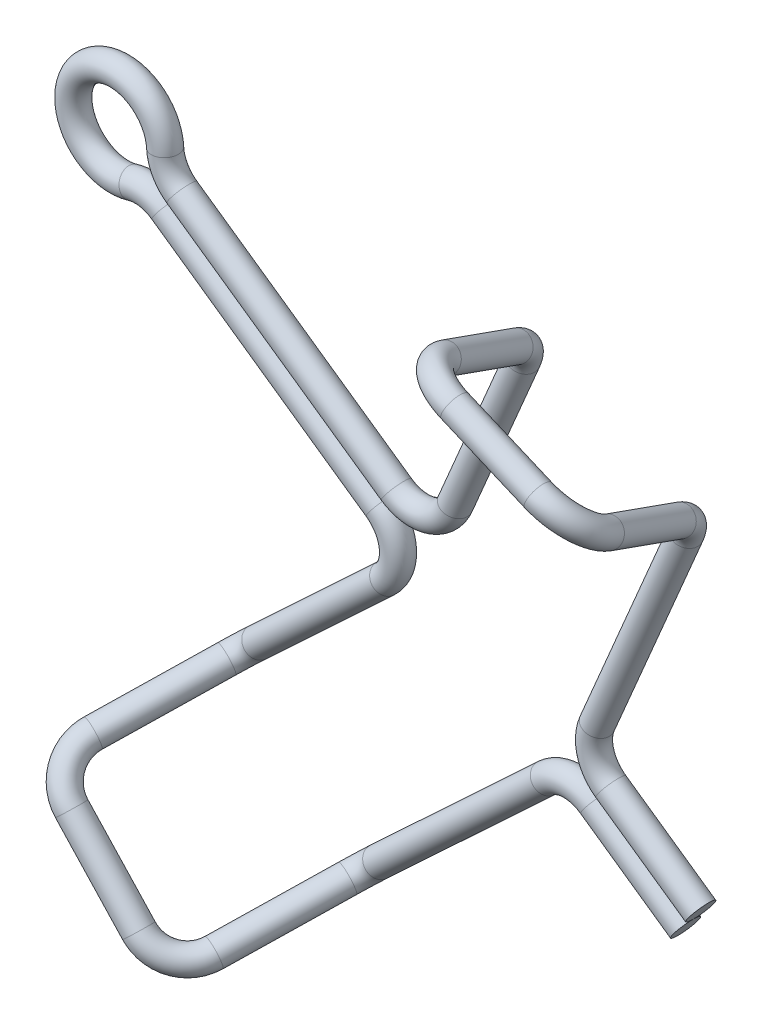
ISO-10303-21;
HEADER;
FILE_DESCRIPTION(('STEP AP214'),'2;1');
FILE_NAME('part.step','',(''),(''),'','','');
FILE_SCHEMA(('AUTOMOTIVE_DESIGN { 1 0 10303 214 1 1 1 1 }'));
ENDSEC;
DATA;
#1=APPLICATION_CONTEXT('core data for automotive mechanical design processes');
#2=APPLICATION_PROTOCOL_DEFINITION('international standard','automotive_design',2000,#1);
#3=PRODUCT_CONTEXT('',#1,'mechanical');
#4=PRODUCT('Part','Part','',(#3));
#5=PRODUCT_RELATED_PRODUCT_CATEGORY('part','',(#4));
#6=PRODUCT_DEFINITION_FORMATION('','',#4);
#7=PRODUCT_DEFINITION_CONTEXT('part definition',#1,'design');
#8=PRODUCT_DEFINITION('design','',#6,#7);
#9=PRODUCT_DEFINITION_SHAPE('','',#8);
#10=(LENGTH_UNIT() NAMED_UNIT(*) SI_UNIT(.MILLI.,.METRE.));
#11=(NAMED_UNIT(*) PLANE_ANGLE_UNIT() SI_UNIT($,.RADIAN.));
#12=(NAMED_UNIT(*) SI_UNIT($,.STERADIAN.) SOLID_ANGLE_UNIT());
#13=UNCERTAINTY_MEASURE_WITH_UNIT(LENGTH_MEASURE(1.E-05),#10,'distance_accuracy_value','');
#14=(GEOMETRIC_REPRESENTATION_CONTEXT(3) GLOBAL_UNCERTAINTY_ASSIGNED_CONTEXT((#13)) GLOBAL_UNIT_ASSIGNED_CONTEXT((#10,
#11,#12)) REPRESENTATION_CONTEXT('',''));
#15=CARTESIAN_POINT('',(0.,0.,0.));
#16=DIRECTION('',(0.,0.,1.));
#17=DIRECTION('',(1.,0.,0.));
#18=AXIS2_PLACEMENT_3D('',#15,#16,#17);
#19=CARTESIAN_POINT('',(31.8925850738149,21.4058785131704,-5.74237859128242));
#20=DIRECTION('',(-0.819202095156444,0.573504949665905,0.));
#21=DIRECTION('',(-0.573504949665905,-0.819202095156444,0.));
#22=AXIS2_PLACEMENT_3D('',#19,#20,#21);
#23=PLANE('',#22);
#24=CARTESIAN_POINT('',(31.8925850738149,21.4058785131704,-5.74237859128242));
#25=DIRECTION('',(0.819202095156458,-0.573504949665886,0.));
#26=DIRECTION('',(0.573504949665886,0.819202095156458,0.));
#27=AXIS2_PLACEMENT_3D('',#24,#25,#26);
#28=CIRCLE('',#27,0.254);
#29=CARTESIAN_POINT('',(32.0382553310301,21.6139558453402,-5.74237859128242));
#30=VERTEX_POINT('',#29);
#31=EDGE_CURVE('E18',#30,#30,#28,.F.);
#32=ORIENTED_EDGE('',*,*,#31,.F.);
#33=EDGE_LOOP('',(#32));
#34=FACE_BOUND('',#33,.T.);
#35=ADVANCED_FACE('F15',(#34),#23,.F.);
#36=CARTESIAN_POINT('',(30.1528788256894,22.6238077032491,-5.74237859128242));
#37=DIRECTION('',(0.819202095156458,-0.573504949665886,0.));
#38=DIRECTION('',(0.573504949665886,0.819202095156458,0.));
#39=AXIS2_PLACEMENT_3D('',#36,#37,#38);
#40=CYLINDRICAL_SURFACE('',#39,0.254);
#41=ORIENTED_EDGE('',*,*,#31,.T.);
#42=EDGE_LOOP('',(#41));
#43=FACE_BOUND('',#42,.T.);
#44=CARTESIAN_POINT('',(30.1528788256894,22.6238077032491,-5.74237859128242));
#45=DIRECTION('',(0.819202095156492,-0.573504949665837,0.));
#46=DIRECTION('',(-0.573504949665842,-0.819202095156488,0.));
#47=AXIS2_PLACEMENT_3D('',#44,#45,#46);
#48=CIRCLE('',#47,0.254);
#49=CARTESIAN_POINT('',(30.0072085684743,22.4157303710793,-5.74237859128242));
#50=VERTEX_POINT('',#49);
#51=EDGE_CURVE('E219',#50,#50,#48,.F.);
#52=ORIENTED_EDGE('',*,*,#51,.F.);
#53=EDGE_LOOP('',(#52));
#54=FACE_BOUND('',#53,.T.);
#55=ADVANCED_FACE('F214',(#43,#54),#40,.T.);
#56=CARTESIAN_POINT('',(30.5898895973348,23.2480396997583,-5.74237859128242));
#57=DIRECTION('',(0.,0.,1.));
#58=DIRECTION('',(-0.819152044288986,0.573576436351055,0.));
#59=AXIS2_PLACEMENT_3D('',#56,#57,#58);
#60=TOROIDAL_SURFACE('',#59,0.762000000000001,0.254);
#61=CARTESIAN_POINT('',(29.8884389192096,23.5457156076813,-5.74237859128242));
#62=DIRECTION('',(-0.39065079779923,-0.920538947670779,0.));
#63=DIRECTION('',(0.920538947670779,-0.39065079779923,0.));
#64=AXIS2_PLACEMENT_3D('',#61,#62,#63);
#65=CIRCLE('',#64,0.253999999999999);
#66=CARTESIAN_POINT('',(30.1222558119179,23.4464903050403,-5.74237859128242));
#67=VERTEX_POINT('',#66);
#68=EDGE_CURVE('E218',#67,#67,#65,.F.);
#69=ORIENTED_EDGE('',*,*,#68,.F.);
#70=EDGE_LOOP('',(#69));
#71=FACE_BOUND('',#70,.T.);
#72=ORIENTED_EDGE('',*,*,#51,.T.);
#73=EDGE_LOOP('',(#72));
#74=FACE_BOUND('',#73,.T.);
#75=ADVANCED_FACE('F210',(#71,#74),#60,.T.);
#76=CARTESIAN_POINT('',(31.6029414574105,27.5858106777175,-5.74237859128242));
#77=DIRECTION('',(-0.39065079779923,-0.920538947670779,0.));
#78=DIRECTION('',(0.920538947670779,-0.39065079779923,0.));
#79=AXIS2_PLACEMENT_3D('',#76,#77,#78);
#80=CYLINDRICAL_SURFACE('',#79,0.253999999999999);
#81=ORIENTED_EDGE('',*,*,#68,.T.);
#82=EDGE_LOOP('',(#81));
#83=FACE_BOUND('',#82,.T.);
#84=CARTESIAN_POINT('',(31.6029414574105,27.5858106777175,-5.74237859128241));
#85=DIRECTION('',(-0.390650797799221,-0.920538947670783,0.));
#86=DIRECTION('',(0.,0.,-1.));
#87=AXIS2_PLACEMENT_3D('',#84,#85,#86);
#88=CIRCLE('',#87,0.254);
#89=CARTESIAN_POINT('',(31.6029414574105,27.5858106777175,-5.99637859128241));
#90=VERTEX_POINT('',#89);
#91=EDGE_CURVE('E193',#90,#90,#88,.F.);
#92=ORIENTED_EDGE('',*,*,#91,.F.);
#93=EDGE_LOOP('',(#92));
#94=FACE_BOUND('',#93,.T.);
#95=ADVANCED_FACE('F205',(#83,#94),#80,.T.);
#96=CARTESIAN_POINT('',(31.6029414574105,27.5858106777175,-5.15817859128242));
#97=DIRECTION('',(-0.920538947670783,0.390650797799221,0.));
#98=DIRECTION('',(0.390650797799221,0.920538947670783,0.));
#99=AXIS2_PLACEMENT_3D('',#96,#97,#98);
#100=TOROIDAL_SURFACE('',#99,0.5842,0.254);
#101=CARTESIAN_POINT('',(31.8044461642809,28.0606412216667,-5.43244387826194));
#102=DIRECTION('',(-0.183399440546353,-0.43216685836828,-0.882947592858928));
#103=DIRECTION('',(0.,0.898182130665292,-0.439623543675219));
#104=AXIS2_PLACEMENT_3D('',#101,#102,#103);
#105=CIRCLE('',#104,0.254);
#106=CARTESIAN_POINT('',(31.8044461642809,28.2887794828557,-5.54410825835545));
#107=VERTEX_POINT('',#106);
#108=EDGE_CURVE('E189',#107,#107,#105,.F.);
#109=ORIENTED_EDGE('',*,*,#108,.F.);
#110=EDGE_LOOP('',(#109));
#111=FACE_BOUND('',#110,.T.);
#112=ORIENTED_EDGE('',*,*,#91,.T.);
#113=EDGE_LOOP('',(#112));
#114=FACE_BOUND('',#113,.T.);
#115=ADVANCED_FACE('F200',(#111,#114),#100,.T.);
#116=CARTESIAN_POINT('',(31.5998515162474,20.987811666424,-5.74237859128242));
#117=DIRECTION('',(0.819101987183321,-0.57364791866818,0.));
#118=DIRECTION('',(0.57364791866818,0.819101987183321,0.));
#119=AXIS2_PLACEMENT_3D('',#116,#117,#118);
#120=PLANE('',#119);
#121=CARTESIAN_POINT('',(31.5998515162474,20.9878116664239,-5.74237859128242));
#122=DIRECTION('',(0.819101987183319,-0.573647918668182,0.));
#123=DIRECTION('',(0.573647918668182,0.819101987183319,0.));
#124=AXIS2_PLACEMENT_3D('',#121,#122,#123);
#125=CIRCLE('',#124,0.254000000000002);
#126=CARTESIAN_POINT('',(31.7455580875891,21.1958635711685,-5.74237859128242));
#127=VERTEX_POINT('',#126);
#128=EDGE_CURVE('E188',#127,#127,#125,.F.);
#129=ORIENTED_EDGE('',*,*,#128,.F.);
#130=EDGE_LOOP('',(#129));
#131=FACE_BOUND('',#130,.T.);
#132=ADVANCED_FACE('F204',(#131),#120,.T.);
#133=CARTESIAN_POINT('',(32.1686365966458,28.9188283270038,-3.67910665628968));
#134=DIRECTION('',(-0.183399440546353,-0.43216685836828,-0.882947592858928));
#135=DIRECTION('',(0.,0.898182130665292,-0.439623543675219));
#136=AXIS2_PLACEMENT_3D('',#133,#134,#135);
#137=CYLINDRICAL_SURFACE('',#136,0.254);
#138=ORIENTED_EDGE('',*,*,#108,.T.);
#139=EDGE_LOOP('',(#138));
#140=FACE_BOUND('',#139,.T.);
#141=CARTESIAN_POINT('',(32.1686365966458,28.9188283270038,-3.67910665628969));
#142=DIRECTION('',(-0.183399440546373,-0.43216685836827,-0.882947592858929));
#143=DIRECTION('',(0.920538947670782,-0.390650797799224,0.));
#144=AXIS2_PLACEMENT_3D('',#141,#142,#143);
#145=CIRCLE('',#144,0.254);
#146=CARTESIAN_POINT('',(32.4024534893542,28.8196030243628,-3.6791066562897));
#147=VERTEX_POINT('',#146);
#148=EDGE_CURVE('E183',#147,#147,#145,.F.);
#149=ORIENTED_EDGE('',*,*,#148,.F.);
#150=EDGE_LOOP('',(#149));
#151=FACE_BOUND('',#150,.T.);
#152=ADVANCED_FACE('F227',(#140,#151),#137,.T.);
#153=CARTESIAN_POINT('',(29.8603578633623,22.2060444739714,-5.74237859128242));
#154=DIRECTION('',(0.819101987183319,-0.573647918668182,0.));
#155=DIRECTION('',(0.573647918668182,0.819101987183319,0.));
#156=AXIS2_PLACEMENT_3D('',#153,#154,#155);
#157=CYLINDRICAL_SURFACE('',#156,0.254000000000002);
#158=CARTESIAN_POINT('',(29.8603578633622,22.2060444739714,-5.74237859128242));
#159=DIRECTION('',(-0.819101987183367,0.573647918668114,0.));
#160=DIRECTION('',(0.573647918668119,0.819101987183364,0.));
#161=AXIS2_PLACEMENT_3D('',#158,#159,#160);
#162=CIRCLE('',#161,0.254);
#163=CARTESIAN_POINT('',(30.006064434704,22.414096378716,-5.74237859128242));
#164=VERTEX_POINT('',#163);
#165=EDGE_CURVE('E187',#164,#164,#162,.T.);
#166=ORIENTED_EDGE('',*,*,#165,.F.);
#167=EDGE_LOOP('',(#166));
#168=FACE_BOUND('',#167,.T.);
#169=ORIENTED_EDGE('',*,*,#128,.T.);
#170=EDGE_LOOP('',(#169));
#171=FACE_BOUND('',#170,.T.);
#172=ADVANCED_FACE('F224',(#168,#171),#157,.T.);
#173=CARTESIAN_POINT('',(29.4232381493371,21.5818887597377,-5.74237859128242));
#174=DIRECTION('',(0.,0.,1.));
#175=DIRECTION('',(-0.819152044288986,0.573576436351055,0.));
#176=AXIS2_PLACEMENT_3D('',#173,#174,#175);
#177=TOROIDAL_SURFACE('',#176,0.762000000000001,0.254);
#178=ORIENTED_EDGE('',*,*,#165,.T.);
#179=EDGE_LOOP('',(#178));
#180=FACE_BOUND('',#179,.T.);
#181=CARTESIAN_POINT('',(28.9036040338079,22.1392256291248,-5.74237859128242));
#182=DIRECTION('',(-0.731413214418695,-0.681934534815265,0.));
#183=DIRECTION('',(0.681934534815265,-0.731413214418695,0.));
#184=AXIS2_PLACEMENT_3D('',#181,#182,#183);
#185=CIRCLE('',#184,0.253999999999999);
#186=CARTESIAN_POINT('',(29.0768154056509,21.9534466726624,-5.74237859128242));
#187=VERTEX_POINT('',#186);
#188=EDGE_CURVE('E179',#187,#187,#185,.T.);
#189=ORIENTED_EDGE('',*,*,#188,.F.);
#190=EDGE_LOOP('',(#189));
#191=FACE_BOUND('',#190,.T.);
#192=ADVANCED_FACE('F173',(#180,#191),#177,.T.);
#193=CARTESIAN_POINT('',(31.3970408507082,29.2462718257191,-3.67910665628967));
#194=DIRECTION('',(0.344924181565241,0.81278764797881,-0.469471562785887));
#195=DIRECTION('',(0.273937055528815,0.391222659826264,0.878580286625341));
#196=AXIS2_PLACEMENT_3D('',#193,#194,#195);
#197=TOROIDAL_SURFACE('',#196,0.8382,0.254);
#198=ORIENTED_EDGE('',*,*,#148,.T.);
#199=EDGE_LOOP('',(#198));
#200=FACE_BOUND('',#199,.T.);
#201=CARTESIAN_POINT('',(31.5507662617741,29.6085140864033,-2.93901998395531));
#202=DIRECTION('',(0.920538947670779,-0.39065079779923,0.));
#203=DIRECTION('',(0.39065079779923,0.920538947670779,0.));
#204=AXIS2_PLACEMENT_3D('',#201,#202,#203);
#205=CIRCLE('',#204,0.253999999999999);
#206=CARTESIAN_POINT('',(31.6499915644151,29.8423309791117,-2.93901998395531));
#207=VERTEX_POINT('',#206);
#208=EDGE_CURVE('E526',#207,#207,#205,.F.);
#209=ORIENTED_EDGE('',*,*,#208,.F.);
#210=EDGE_LOOP('',(#209));
#211=FACE_BOUND('',#210,.T.);
#212=ADVANCED_FACE('F168',(#200,#211),#197,.T.);
#213=CARTESIAN_POINT('',(29.9374297020863,30.2931686746262,-2.93901998395532));
#214=DIRECTION('',(0.920538947670779,-0.39065079779923,0.));
#215=DIRECTION('',(0.39065079779923,0.920538947670779,0.));
#216=AXIS2_PLACEMENT_3D('',#213,#214,#215);
#217=CYLINDRICAL_SURFACE('',#216,0.253999999999999);
#218=CARTESIAN_POINT('',(29.9374297020863,30.2931686746263,-2.93901998395532));
#219=DIRECTION('',(0.920538947670783,-0.390650797799221,0.));
#220=DIRECTION('',(0.183399440546352,0.432166858368282,0.882947592858927));
#221=AXIS2_PLACEMENT_3D('',#218,#219,#220);
#222=CIRCLE('',#221,0.254);
#223=CARTESIAN_POINT('',(29.9840131599851,30.4029390566518,-2.71475129536915));
#224=VERTEX_POINT('',#223);
#225=EDGE_CURVE('E528',#224,#224,#222,.F.);
#226=ORIENTED_EDGE('',*,*,#225,.F.);
#227=EDGE_LOOP('',(#226));
#228=FACE_BOUND('',#227,.T.);
#229=ORIENTED_EDGE('',*,*,#208,.T.);
#230=EDGE_LOOP('',(#229));
#231=FACE_BOUND('',#230,.T.);
#232=ADVANCED_FACE('F164',(#228,#231),#217,.T.);
#233=CARTESIAN_POINT('',(28.9036040338079,22.1392256291248,-5.74237859128242));
#234=DIRECTION('',(-0.731413214418695,-0.681934534815265,0.));
#235=DIRECTION('',(0.681934534815265,-0.731413214418695,0.));
#236=AXIS2_PLACEMENT_3D('',#233,#234,#235);
#237=CYLINDRICAL_SURFACE('',#236,0.253999999999999);
#238=ORIENTED_EDGE('',*,*,#188,.T.);
#239=EDGE_LOOP('',(#238));
#240=FACE_BOUND('',#239,.T.);
#241=CARTESIAN_POINT('',(25.6600627354343,19.1151035831231,-5.74237859128243));
#242=DIRECTION('',(-0.731413214418693,-0.681934534815267,0.));
#243=DIRECTION('',(0.,0.,-1.));
#244=AXIS2_PLACEMENT_3D('',#241,#242,#243);
#245=CIRCLE('',#244,0.254);
#246=CARTESIAN_POINT('',(25.6600627354343,19.1151035831231,-5.99637859128243));
#247=VERTEX_POINT('',#246);
#248=EDGE_CURVE('E145',#247,#247,#245,.T.);
#249=ORIENTED_EDGE('',*,*,#248,.F.);
#250=EDGE_LOOP('',(#249));
#251=FACE_BOUND('',#250,.T.);
#252=ADVANCED_FACE('F160',(#240,#251),#237,.T.);
#253=CARTESIAN_POINT('',(25.6600627354343,19.1151035831232,-5.23437859128243));
#254=DIRECTION('',(-0.681934534815267,0.731413214418693,0.));
#255=DIRECTION('',(0.731413214418693,0.681934534815267,0.));
#256=AXIS2_PLACEMENT_3D('',#253,#254,#255);
#257=TOROIDAL_SURFACE('',#256,0.508,0.254);
#258=ORIENTED_EDGE('',*,*,#248,.T.);
#259=EDGE_LOOP('',(#258));
#260=FACE_BOUND('',#259,.T.);
#261=CARTESIAN_POINT('',(25.3319965706098,18.8092304554739,-5.47287014517765));
#262=DIRECTION('',(-0.343377704815393,-0.320148871777393,0.882947592858928));
#263=DIRECTION('',(0.932001392324765,0.,0.362454693313107));
#264=AXIS2_PLACEMENT_3D('',#261,#262,#263);
#265=CIRCLE('',#264,0.254);
#266=CARTESIAN_POINT('',(25.5687249242603,18.8092304554739,-5.38080665307612));
#267=VERTEX_POINT('',#266);
#268=EDGE_CURVE('E142',#267,#267,#265,.T.);
#269=ORIENTED_EDGE('',*,*,#268,.F.);
#270=EDGE_LOOP('',(#269));
#271=FACE_BOUND('',#270,.T.);
#272=ADVANCED_FACE('F156',(#260,#271),#257,.T.);
#273=CARTESIAN_POINT('',(29.7837042910204,29.930926413942,-3.67910665628968));
#274=DIRECTION('',(0.344924181565242,0.812787647978809,-0.469471562785888));
#275=DIRECTION('',(0.27393705552881,0.391222659826267,0.878580286625341));
#276=AXIS2_PLACEMENT_3D('',#273,#274,#275);
#277=TOROIDAL_SURFACE('',#276,0.8382,0.254);
#278=ORIENTED_EDGE('',*,*,#225,.T.);
#279=EDGE_LOOP('',(#278));
#280=FACE_BOUND('',#279,.T.);
#281=CARTESIAN_POINT('',(29.0121085450827,30.2583699126573,-3.67910665628965));
#282=DIRECTION('',(0.183399440546358,0.43216685836828,0.882947592858928));
#283=DIRECTION('',(0.,-0.898182130665291,0.439623543675219));
#284=AXIS2_PLACEMENT_3D('',#281,#282,#283);
#285=CIRCLE('',#284,0.254);
#286=CARTESIAN_POINT('',(29.0121085450827,30.0302316514683,-3.56744227619614));
#287=VERTEX_POINT('',#286);
#288=EDGE_CURVE('E139',#287,#287,#285,.F.);
#289=ORIENTED_EDGE('',*,*,#288,.F.);
#290=EDGE_LOOP('',(#289));
#291=FACE_BOUND('',#290,.T.);
#292=ADVANCED_FACE('F151',(#280,#291),#277,.T.);
#293=CARTESIAN_POINT('',(25.3319965706098,18.8092304554739,-5.47287014517766));
#294=DIRECTION('',(-0.343377704815393,-0.320148871777393,0.882947592858928));
#295=DIRECTION('',(0.932001392324765,0.,0.362454693313107));
#296=AXIS2_PLACEMENT_3D('',#293,#294,#295);
#297=CYLINDRICAL_SURFACE('',#296,0.254);
#298=ORIENTED_EDGE('',*,*,#268,.T.);
#299=EDGE_LOOP('',(#298));
#300=FACE_BOUND('',#299,.T.);
#301=CARTESIAN_POINT('',(24.6082378161503,18.1344325713078,-3.61182604971385));
#302=DIRECTION('',(-0.343377704815382,-0.320148871777403,0.882947592858929));
#303=DIRECTION('',(0.681934534815275,-0.731413214418686,0.));
#304=AXIS2_PLACEMENT_3D('',#301,#302,#303);
#305=CIRCLE('',#304,0.254);
#306=CARTESIAN_POINT('',(24.7814491879934,17.9486536148455,-3.61182604971385));
#307=VERTEX_POINT('',#306);
#308=EDGE_CURVE('E134',#307,#307,#305,.T.);
#309=ORIENTED_EDGE('',*,*,#308,.F.);
#310=EDGE_LOOP('',(#309));
#311=FACE_BOUND('',#310,.T.);
#312=ADVANCED_FACE('F155',(#300,#311),#297,.T.);
#313=CARTESIAN_POINT('',(28.6479181127178,29.4001828073202,-5.43244387826192));
#314=DIRECTION('',(0.183399440546358,0.43216685836828,0.882947592858928));
#315=DIRECTION('',(0.,-0.898182130665291,0.439623543675219));
#316=AXIS2_PLACEMENT_3D('',#313,#314,#315);
#317=CYLINDRICAL_SURFACE('',#316,0.254);
#318=ORIENTED_EDGE('',*,*,#288,.T.);
#319=EDGE_LOOP('',(#318));
#320=FACE_BOUND('',#319,.T.);
#321=CARTESIAN_POINT('',(28.6479181127178,29.4001828073202,-5.43244387826192));
#322=DIRECTION('',(0.183399440546341,0.432166858368252,0.882947592858945));
#323=DIRECTION('',(0.344924181565255,0.812787647978821,-0.469471562785858));
#324=AXIS2_PLACEMENT_3D('',#321,#322,#323);
#325=CIRCLE('',#324,0.254);
#326=CARTESIAN_POINT('',(28.7355288548354,29.6066308699069,-5.55168965520953));
#327=VERTEX_POINT('',#326);
#328=EDGE_CURVE('E131',#327,#327,#325,.F.);
#329=ORIENTED_EDGE('',*,*,#328,.F.);
#330=EDGE_LOOP('',(#329));
#331=FACE_BOUND('',#330,.T.);
#332=ADVANCED_FACE('F304',(#320,#331),#317,.T.);
#333=CARTESIAN_POINT('',(24.088603700621,18.6917694406948,-3.61182604971384));
#334=DIRECTION('',(-0.645799537056196,-0.602112456002514,-0.469471562785888));
#335=DIRECTION('',(0.273937055528809,0.391222659826268,-0.878580286625341));
#336=AXIS2_PLACEMENT_3D('',#333,#334,#335);
#337=TOROIDAL_SURFACE('',#336,0.761999999999999,0.254);
#338=ORIENTED_EDGE('',*,*,#308,.T.);
#339=EDGE_LOOP('',(#338));
#340=FACE_BOUND('',#339,.T.);
#341=CARTESIAN_POINT('',(23.8269498895517,18.4478160004005,-2.93901998395533));
#342=DIRECTION('',(-0.681934534815272,0.731413214418688,0.));
#343=DIRECTION('',(-0.731413214418688,-0.681934534815272,0.));
#344=AXIS2_PLACEMENT_3D('',#341,#342,#343);
#345=CIRCLE('',#344,0.254000000000001);
#346=CARTESIAN_POINT('',(23.6411709330893,18.2746046285574,-2.93901998395533));
#347=VERTEX_POINT('',#346);
#348=EDGE_CURVE('E129',#347,#347,#345,.T.);
#349=ORIENTED_EDGE('',*,*,#348,.F.);
#350=EDGE_LOOP('',(#349));
#351=FACE_BOUND('',#350,.T.);
#352=ADVANCED_FACE('F122',(#340,#351),#337,.T.);
#353=CARTESIAN_POINT('',(28.4464134058474,28.925352263371,-5.15817859128242));
#354=DIRECTION('',(0.920538947670783,-0.39065079779922,0.));
#355=DIRECTION('',(-0.39065079779922,-0.920538947670783,0.));
#356=AXIS2_PLACEMENT_3D('',#353,#354,#355);
#357=TOROIDAL_SURFACE('',#356,0.5842,0.254);
#358=ORIENTED_EDGE('',*,*,#328,.T.);
#359=EDGE_LOOP('',(#358));
#360=FACE_BOUND('',#359,.T.);
#361=CARTESIAN_POINT('',(28.4464134058474,28.925352263371,-5.74237859128243));
#362=DIRECTION('',(0.390650797799213,0.920538947670786,0.));
#363=DIRECTION('',(-0.920538947670786,0.390650797799213,0.));
#364=AXIS2_PLACEMENT_3D('',#361,#362,#363);
#365=CIRCLE('',#364,0.254000000000001);
#366=CARTESIAN_POINT('',(28.212596513139,29.024577566012,-5.74237859128243));
#367=VERTEX_POINT('',#366);
#368=EDGE_CURVE('E543',#367,#367,#365,.F.);
#369=ORIENTED_EDGE('',*,*,#368,.F.);
#370=EDGE_LOOP('',(#369));
#371=FACE_BOUND('',#370,.T.);
#372=ADVANCED_FACE('F117',(#360,#371),#357,.T.);
#373=CARTESIAN_POINT('',(27.1431851562673,25.8543938314368,-5.74237859128243));
#374=DIRECTION('',(0.390650797799213,0.920538947670786,0.));
#375=DIRECTION('',(-0.920538947670786,0.390650797799213,0.));
#376=AXIS2_PLACEMENT_3D('',#373,#374,#375);
#377=CYLINDRICAL_SURFACE('',#376,0.254000000000001);
#378=ORIENTED_EDGE('',*,*,#368,.T.);
#379=EDGE_LOOP('',(#378));
#380=FACE_BOUND('',#379,.T.);
#381=CARTESIAN_POINT('',(27.1431851562673,25.8543938314369,-5.74237859128243));
#382=DIRECTION('',(0.390650797799139,0.920538947670818,0.));
#383=DIRECTION('',(0.920538947670818,-0.390650797799138,0.));
#384=AXIS2_PLACEMENT_3D('',#381,#382,#383);
#385=CIRCLE('',#384,0.254);
#386=CARTESIAN_POINT('',(27.3770020489757,25.7551685287959,-5.74237859128243));
#387=VERTEX_POINT('',#386);
#388=EDGE_CURVE('E546',#387,#387,#385,.F.);
#389=ORIENTED_EDGE('',*,*,#388,.F.);
#390=EDGE_LOOP('',(#389));
#391=FACE_BOUND('',#390,.T.);
#392=ADVANCED_FACE('F113',(#380,#391),#377,.T.);
#393=CARTESIAN_POINT('',(23.8269498895517,18.4478160004005,-2.93901998395533));
#394=DIRECTION('',(-0.681934534815272,0.731413214418688,0.));
#395=DIRECTION('',(-0.731413214418688,-0.681934534815272,0.));
#396=AXIS2_PLACEMENT_3D('',#393,#394,#395);
#397=CYLINDRICAL_SURFACE('',#396,0.254000000000001);
#398=ORIENTED_EDGE('',*,*,#348,.T.);
#399=EDGE_LOOP('',(#398));
#400=FACE_BOUND('',#399,.T.);
#401=CARTESIAN_POINT('',(22.5278646007286,19.8411581738681,-2.93901998395533));
#402=DIRECTION('',(-0.681934534815274,0.731413214418687,0.));
#403=DIRECTION('',(-0.343377704815379,-0.320148871777408,0.882947592858928));
#404=AXIS2_PLACEMENT_3D('',#401,#402,#403);
#405=CIRCLE('',#404,0.254);
#406=CARTESIAN_POINT('',(22.4406466637055,19.7598403604367,-2.71475129536916));
#407=VERTEX_POINT('',#406);
#408=EDGE_CURVE('E97',#407,#407,#405,.T.);
#409=ORIENTED_EDGE('',*,*,#408,.F.);
#410=EDGE_LOOP('',(#409));
#411=FACE_BOUND('',#410,.T.);
#412=ADVANCED_FACE('F109',(#400,#411),#397,.T.);
#413=CARTESIAN_POINT('',(22.789518411798,20.0851116141625,-3.61182604971384));
#414=DIRECTION('',(-0.645799537056197,-0.602112456002513,-0.469471562785889));
#415=DIRECTION('',(0.273937055528807,0.39122265982627,-0.87858028662534));
#416=AXIS2_PLACEMENT_3D('',#413,#414,#415);
#417=TOROIDAL_SURFACE('',#416,0.762,0.254);
#418=CARTESIAN_POINT('',(22.2698842962687,20.6424484835495,-3.61182604971382));
#419=DIRECTION('',(0.343377704815393,0.320148871777392,-0.882947592858928));
#420=DIRECTION('',(-0.932001392324766,0.,-0.362454693313107));
#421=AXIS2_PLACEMENT_3D('',#418,#419,#420);
#422=CIRCLE('',#421,0.254);
#423=CARTESIAN_POINT('',(22.0331559426183,20.6424484835495,-3.70388954181535));
#424=VERTEX_POINT('',#423);
#425=EDGE_CURVE('E94',#424,#424,#422,.T.);
#426=ORIENTED_EDGE('',*,*,#425,.F.);
#427=EDGE_LOOP('',(#426));
#428=FACE_BOUND('',#427,.T.);
#429=ORIENTED_EDGE('',*,*,#408,.T.);
#430=EDGE_LOOP('',(#429));
#431=FACE_BOUND('',#430,.T.);
#432=ADVANCED_FACE('F105',(#428,#431),#417,.T.);
#433=CARTESIAN_POINT('',(26.4417344781421,26.1520697393599,-5.74237859128243));
#434=DIRECTION('',(0.,0.,1.));
#435=DIRECTION('',(-0.819152044288989,0.57357643635105,0.));
#436=AXIS2_PLACEMENT_3D('',#433,#434,#435);
#437=TOROIDAL_SURFACE('',#436,0.762000000000002,0.254);
#438=ORIENTED_EDGE('',*,*,#388,.T.);
#439=EDGE_LOOP('',(#438));
#440=FACE_BOUND('',#439,.T.);
#441=CARTESIAN_POINT('',(26.0047237064967,25.5278377428506,-5.74237859128243));
#442=DIRECTION('',(0.819202095156458,-0.573504949665886,0.));
#443=DIRECTION('',(0.573504949665886,0.819202095156458,0.));
#444=AXIS2_PLACEMENT_3D('',#441,#442,#443);
#445=CIRCLE('',#444,0.254);
#446=CARTESIAN_POINT('',(26.1503939637119,25.7359150750204,-5.74237859128243));
#447=VERTEX_POINT('',#446);
#448=EDGE_CURVE('E90',#447,#447,#445,.F.);
#449=ORIENTED_EDGE('',*,*,#448,.F.);
#450=EDGE_LOOP('',(#449));
#451=FACE_BOUND('',#450,.T.);
#452=ADVANCED_FACE('F102',(#440,#451),#437,.T.);
#453=CARTESIAN_POINT('',(22.2698842962687,20.6424484835495,-3.61182604971383));
#454=DIRECTION('',(0.343377704815393,0.320148871777392,-0.882947592858928));
#455=DIRECTION('',(-0.932001392324766,0.,-0.362454693313107));
#456=AXIS2_PLACEMENT_3D('',#453,#454,#455);
#457=CYLINDRICAL_SURFACE('',#456,0.254);
#458=CARTESIAN_POINT('',(22.9936430507282,21.3172463677156,-5.47287014517767));
#459=DIRECTION('',(0.343377704815413,0.320148871777408,-0.882947592858915));
#460=DIRECTION('',(-0.645799537056189,-0.602112456002502,-0.469471562785913));
#461=AXIS2_PLACEMENT_3D('',#458,#459,#460);
#462=CIRCLE('',#461,0.254);
#463=CARTESIAN_POINT('',(22.829609968316,21.1643098038909,-5.59211592212529));
#464=VERTEX_POINT('',#463);
#465=EDGE_CURVE('E87',#464,#464,#462,.T.);
#466=ORIENTED_EDGE('',*,*,#465,.F.);
#467=EDGE_LOOP('',(#466));
#468=FACE_BOUND('',#467,.T.);
#469=ORIENTED_EDGE('',*,*,#425,.T.);
#470=EDGE_LOOP('',(#469));
#471=FACE_BOUND('',#470,.T.);
#472=ADVANCED_FACE('F81',(#468,#471),#457,.T.);
#473=CARTESIAN_POINT('',(23.3217092155528,21.6231194953649,-5.23437859128242));
#474=DIRECTION('',(0.681934534815266,-0.731413214418694,0.));
#475=DIRECTION('',(-0.731413214418694,-0.681934534815266,0.));
#476=AXIS2_PLACEMENT_3D('',#473,#474,#475);
#477=TOROIDAL_SURFACE('',#476,0.508000000000008,0.254);
#478=CARTESIAN_POINT('',(23.3217092155528,21.6231194953649,-5.74237859128243));
#479=DIRECTION('',(0.731413214418695,0.681934534815265,0.));
#480=DIRECTION('',(-0.681934534815265,0.731413214418695,0.));
#481=AXIS2_PLACEMENT_3D('',#478,#479,#480);
#482=CIRCLE('',#481,0.253999999999999);
#483=CARTESIAN_POINT('',(23.1484978437097,21.8088984518272,-5.74237859128243));
#484=VERTEX_POINT('',#483);
#485=EDGE_CURVE('E86',#484,#484,#482,.T.);
#486=ORIENTED_EDGE('',*,*,#485,.F.);
#487=EDGE_LOOP('',(#486));
#488=FACE_BOUND('',#487,.T.);
#489=ORIENTED_EDGE('',*,*,#465,.T.);
#490=EDGE_LOOP('',(#489));
#491=FACE_BOUND('',#490,.T.);
#492=ADVANCED_FACE('F76',(#488,#491),#477,.T.);
#493=CARTESIAN_POINT('',(21.8562992538755,28.4320563367238,-5.74237859128243));
#494=DIRECTION('',(0.819202095156458,-0.573504949665886,0.));
#495=DIRECTION('',(0.573504949665886,0.819202095156458,0.));
#496=AXIS2_PLACEMENT_3D('',#493,#494,#495);
#497=CYLINDRICAL_SURFACE('',#496,0.254);
#498=ORIENTED_EDGE('',*,*,#448,.T.);
#499=EDGE_LOOP('',(#498));
#500=FACE_BOUND('',#499,.T.);
#501=CARTESIAN_POINT('',(21.8562992538756,28.4320563367238,-5.74237859128242));
#502=DIRECTION('',(0.819202095156491,-0.573504949665838,0.));
#503=DIRECTION('',(-0.573504949665837,-0.819202095156491,0.));
#504=AXIS2_PLACEMENT_3D('',#501,#502,#503);
#505=CIRCLE('',#504,0.254);
#506=CARTESIAN_POINT('',(21.7106289966605,28.2239790045541,-5.74237859128242));
#507=VERTEX_POINT('',#506);
#508=EDGE_CURVE('E61',#507,#507,#505,.F.);
#509=ORIENTED_EDGE('',*,*,#508,.F.);
#510=EDGE_LOOP('',(#509));
#511=FACE_BOUND('',#510,.T.);
#512=ADVANCED_FACE('F72',(#500,#511),#497,.T.);
#513=CARTESIAN_POINT('',(23.3217092155528,21.6231194953649,-5.74237859128243));
#514=DIRECTION('',(0.731413214418695,0.681934534815265,0.));
#515=DIRECTION('',(-0.681934534815265,0.731413214418695,0.));
#516=AXIS2_PLACEMENT_3D('',#513,#514,#515);
#517=CYLINDRICAL_SURFACE('',#516,0.253999999999999);
#518=ORIENTED_EDGE('',*,*,#485,.T.);
#519=EDGE_LOOP('',(#518));
#520=FACE_BOUND('',#519,.T.);
#521=CARTESIAN_POINT('',(25.7952240577089,23.9293058753648,-5.74237859128243));
#522=DIRECTION('',(0.73141321441865,0.681934534815313,0.));
#523=DIRECTION('',(0.681934534815314,-0.73141321441865,0.));
#524=AXIS2_PLACEMENT_3D('',#521,#522,#523);
#525=CIRCLE('',#524,0.254);
#526=CARTESIAN_POINT('',(25.968435429552,23.7435269189024,-5.74237859128243));
#527=VERTEX_POINT('',#526);
#528=EDGE_CURVE('E58',#527,#527,#525,.T.);
#529=ORIENTED_EDGE('',*,*,#528,.F.);
#530=EDGE_LOOP('',(#529));
#531=FACE_BOUND('',#530,.T.);
#532=ADVANCED_FACE('F68',(#520,#531),#517,.T.);
#533=CARTESIAN_POINT('',(22.2933100255209,29.0562883332331,-5.74237859128242));
#534=DIRECTION('',(0.,0.,1.));
#535=DIRECTION('',(-0.819152044288989,0.57357643635105,0.));
#536=AXIS2_PLACEMENT_3D('',#533,#534,#535);
#537=TOROIDAL_SURFACE('',#536,0.762000000000002,0.254);
#538=CARTESIAN_POINT('',(21.5323438172187,29.0166092477846,-5.74237859128242));
#539=DIRECTION('',(0.0520722906146973,-0.99864331798202,0.));
#540=DIRECTION('',(0.99864331798202,0.0520722906147023,0.));
#541=AXIS2_PLACEMENT_3D('',#538,#539,#540);
#542=CIRCLE('',#541,0.254);
#543=CARTESIAN_POINT('',(21.7859992199861,29.0298356096008,-5.74237859128242));
#544=VERTEX_POINT('',#543);
#545=EDGE_CURVE('E55',#544,#544,#542,.F.);
#546=ORIENTED_EDGE('',*,*,#545,.F.);
#547=EDGE_LOOP('',(#546));
#548=FACE_BOUND('',#547,.T.);
#549=ORIENTED_EDGE('',*,*,#508,.T.);
#550=EDGE_LOOP('',(#549));
#551=FACE_BOUND('',#550,.T.);
#552=ADVANCED_FACE('F65',(#548,#551),#537,.T.);
#553=CARTESIAN_POINT('',(20.6445499075327,28.9703169814282,-5.74237859128242));
#554=DIRECTION('',(0.,0.,-1.));
#555=DIRECTION('',(0.819152044288986,-0.573576436351054,0.));
#556=AXIS2_PLACEMENT_3D('',#553,#554,#555);
#557=TOROIDAL_SURFACE('',#556,0.889,0.254);
#558=ORIENTED_EDGE('',*,*,#545,.T.);
#559=EDGE_LOOP('',(#558));
#560=FACE_BOUND('',#559,.T.);
#561=CARTESIAN_POINT('',(20.9046928066725,28.1202307081434,-5.74237859128243));
#562=DIRECTION('',(-0.956227529004198,-0.292624183509371,0.));
#563=DIRECTION('',(-0.292624183509372,0.956227529004197,0.));
#564=AXIS2_PLACEMENT_3D('',#561,#562,#563);
#565=CIRCLE('',#564,0.254);
#566=CARTESIAN_POINT('',(20.8303662640611,28.3631125005105,-5.74237859128243));
#567=VERTEX_POINT('',#566);
#568=EDGE_CURVE('E32',#567,#567,#565,.F.);
#569=ORIENTED_EDGE('',*,*,#568,.F.);
#570=EDGE_LOOP('',(#569));
#571=FACE_BOUND('',#570,.T.);
#572=ADVANCED_FACE('F48',(#560,#571),#557,.T.);
#573=CARTESIAN_POINT('',(25.2755899421796,24.4866427447518,-5.74237859128243));
#574=DIRECTION('',(0.,0.,1.));
#575=DIRECTION('',(-0.819152044288989,0.57357643635105,0.));
#576=AXIS2_PLACEMENT_3D('',#573,#574,#575);
#577=TOROIDAL_SURFACE('',#576,0.762000000000002,0.254);
#578=ORIENTED_EDGE('',*,*,#528,.T.);
#579=EDGE_LOOP('',(#578));
#580=FACE_BOUND('',#579,.T.);
#581=CARTESIAN_POINT('',(25.7127096562048,25.1107984589855,-5.74237859128243));
#582=DIRECTION('',(-0.819101987183319,0.573647918668182,0.));
#583=DIRECTION('',(-0.573647918668182,-0.819101987183319,0.));
#584=AXIS2_PLACEMENT_3D('',#581,#582,#583);
#585=CIRCLE('',#584,0.254000000000002);
#586=CARTESIAN_POINT('',(25.5670030848631,24.9027465542409,-5.74237859128243));
#587=VERTEX_POINT('',#586);
#588=EDGE_CURVE('E23',#587,#587,#585,.T.);
#589=ORIENTED_EDGE('',*,*,#588,.F.);
#590=EDGE_LOOP('',(#589));
#591=FACE_BOUND('',#590,.T.);
#592=ADVANCED_FACE('F44',(#580,#591),#577,.T.);
#593=CARTESIAN_POINT('',(21.1276724345066,27.3915853310422,-5.74237859128243));
#594=DIRECTION('',(0.,0.,1.));
#595=DIRECTION('',(-0.819152044288989,0.57357643635105,0.));
#596=AXIS2_PLACEMENT_3D('',#593,#594,#595);
#597=TOROIDAL_SURFACE('',#596,0.762000000000002,0.254);
#598=CARTESIAN_POINT('',(21.5647921485318,28.0157410452759,-5.74237859128243));
#599=DIRECTION('',(-0.819101987183319,0.573647918668182,0.));
#600=DIRECTION('',(-0.573647918668182,-0.819101987183319,0.));
#601=AXIS2_PLACEMENT_3D('',#598,#599,#600);
#602=CIRCLE('',#601,0.254000000000002);
#603=CARTESIAN_POINT('',(21.4190855771901,27.8076891405314,-5.74237859128243));
#604=VERTEX_POINT('',#603);
#605=EDGE_CURVE('E10',#604,#604,#602,.F.);
#606=ORIENTED_EDGE('',*,*,#605,.F.);
#607=EDGE_LOOP('',(#606));
#608=FACE_BOUND('',#607,.T.);
#609=ORIENTED_EDGE('',*,*,#568,.T.);
#610=EDGE_LOOP('',(#609));
#611=FACE_BOUND('',#610,.T.);
#612=ADVANCED_FACE('F39',(#608,#611),#597,.T.);
#613=CARTESIAN_POINT('',(25.7127096562048,25.1107984589855,-5.74237859128243));
#614=DIRECTION('',(-0.819101987183319,0.573647918668182,0.));
#615=DIRECTION('',(-0.573647918668182,-0.819101987183319,0.));
#616=AXIS2_PLACEMENT_3D('',#613,#614,#615);
#617=CYLINDRICAL_SURFACE('',#616,0.254000000000002);
#618=ORIENTED_EDGE('',*,*,#605,.T.);
#619=EDGE_LOOP('',(#618));
#620=FACE_BOUND('',#619,.T.);
#621=ORIENTED_EDGE('',*,*,#588,.T.);
#622=EDGE_LOOP('',(#621));
#623=FACE_BOUND('',#622,.T.);
#624=ADVANCED_FACE('F43',(#620,#623),#617,.T.);
#625=CLOSED_SHELL('',(#35,#55,#75,#95,#115,#132,#152,#172,#192,#212,#232,#252,#272,#292,#312,
#332,#352,#372,#392,#412,#432,#452,#472,#492,#512,#532,#552,#572,#592,#612,#624));
#626=MANIFOLD_SOLID_BREP('B1',#625);
#627=ADVANCED_BREP_SHAPE_REPRESENTATION('',(#18,#626),#14);
#628=SHAPE_DEFINITION_REPRESENTATION(#9,#627);
ENDSEC;
END-ISO-10303-21;
